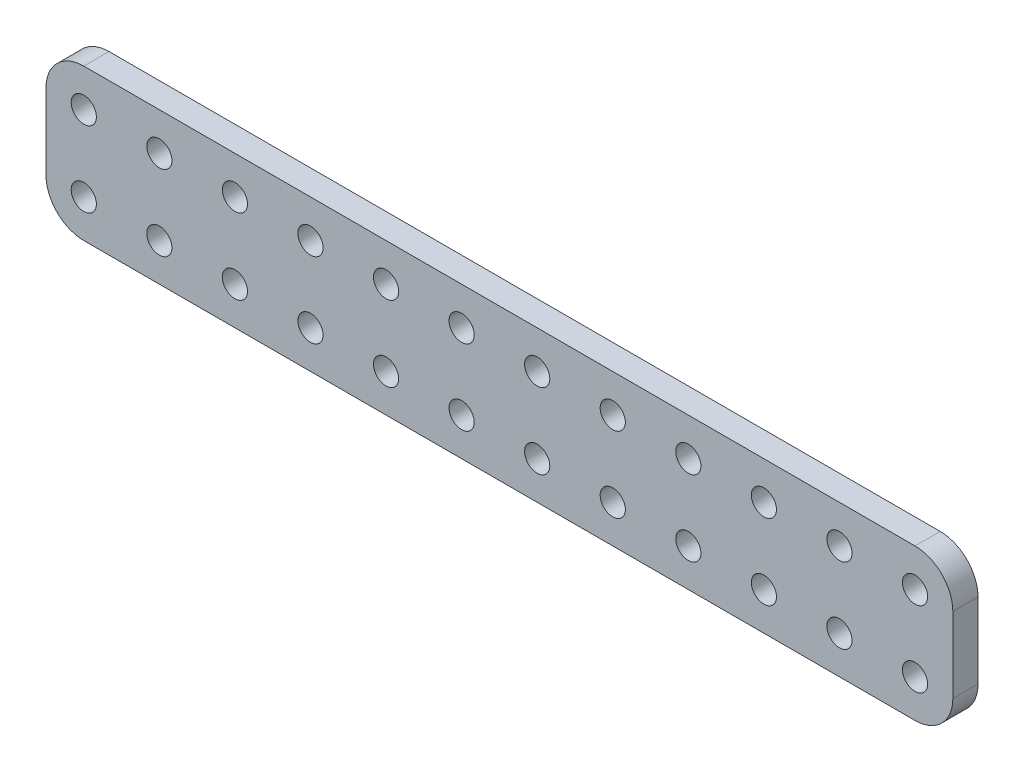
ISO-10303-21;
HEADER;
FILE_DESCRIPTION(('STEP AP214'),'2;1');
FILE_NAME('part.step','',(''),(''),'','','');
FILE_SCHEMA(('AUTOMOTIVE_DESIGN { 1 0 10303 214 1 1 1 1 }'));
ENDSEC;
DATA;
#1=APPLICATION_CONTEXT('core data for automotive mechanical design processes');
#2=APPLICATION_PROTOCOL_DEFINITION('international standard','automotive_design',2000,#1);
#3=PRODUCT_CONTEXT('',#1,'mechanical');
#4=PRODUCT('Part','Part','',(#3));
#5=PRODUCT_RELATED_PRODUCT_CATEGORY('part','',(#4));
#6=PRODUCT_DEFINITION_FORMATION('','',#4);
#7=PRODUCT_DEFINITION_CONTEXT('part definition',#1,'design');
#8=PRODUCT_DEFINITION('design','',#6,#7);
#9=PRODUCT_DEFINITION_SHAPE('','',#8);
#10=(LENGTH_UNIT() NAMED_UNIT(*) SI_UNIT(.MILLI.,.METRE.));
#11=(NAMED_UNIT(*) PLANE_ANGLE_UNIT() SI_UNIT($,.RADIAN.));
#12=(NAMED_UNIT(*) SI_UNIT($,.STERADIAN.) SOLID_ANGLE_UNIT());
#13=UNCERTAINTY_MEASURE_WITH_UNIT(LENGTH_MEASURE(1.E-05),#10,'distance_accuracy_value','');
#14=(GEOMETRIC_REPRESENTATION_CONTEXT(3) GLOBAL_UNCERTAINTY_ASSIGNED_CONTEXT((#13)) GLOBAL_UNIT_ASSIGNED_CONTEXT((#10,
#11,#12)) REPRESENTATION_CONTEXT('',''));
#15=CARTESIAN_POINT('',(0.,0.,0.));
#16=DIRECTION('',(0.,0.,1.));
#17=DIRECTION('',(1.,0.,0.));
#18=AXIS2_PLACEMENT_3D('',#15,#16,#17);
#19=CARTESIAN_POINT('',(355.4291313108,224.2422436139,3.));
#20=DIRECTION('',(0.,0.,1.));
#21=DIRECTION('',(1.,0.,0.));
#22=AXIS2_PLACEMENT_3D('',#19,#20,#21);
#23=PLANE('',#22);
#24=CARTESIAN_POINT('',(355.4291313108,215.2422436139,3.));
#25=DIRECTION('',(0.,0.,1.));
#26=DIRECTION('',(1.,0.,0.));
#27=AXIS2_PLACEMENT_3D('',#24,#25,#26);
#28=CIRCLE('',#27,1.5);
#29=CARTESIAN_POINT('',(356.9291313108,215.2422436139,3.));
#30=VERTEX_POINT('',#29);
#31=EDGE_CURVE('E308',#30,#30,#28,.T.);
#32=ORIENTED_EDGE('',*,*,#31,.F.);
#33=EDGE_LOOP('',(#32));
#34=FACE_BOUND('',#33,.T.);
#35=CARTESIAN_POINT('',(328.4291313108,224.2422436139,3.));
#36=DIRECTION('',(0.,0.,1.));
#37=DIRECTION('',(1.,0.,0.));
#38=AXIS2_PLACEMENT_3D('',#35,#36,#37);
#39=CIRCLE('',#38,1.5);
#40=CARTESIAN_POINT('',(329.9291313108,224.2422436139,3.));
#41=VERTEX_POINT('',#40);
#42=EDGE_CURVE('E296',#41,#41,#39,.T.);
#43=ORIENTED_EDGE('',*,*,#42,.F.);
#44=EDGE_LOOP('',(#43));
#45=FACE_BOUND('',#44,.T.);
#46=CARTESIAN_POINT('',(337.4291313108,224.2422436139,3.));
#47=DIRECTION('',(0.,0.,1.));
#48=DIRECTION('',(1.,0.,0.));
#49=AXIS2_PLACEMENT_3D('',#46,#47,#48);
#50=CIRCLE('',#49,1.5);
#51=CARTESIAN_POINT('',(338.9291313108,224.2422436139,3.));
#52=VERTEX_POINT('',#51);
#53=EDGE_CURVE('E284',#52,#52,#50,.T.);
#54=ORIENTED_EDGE('',*,*,#53,.F.);
#55=EDGE_LOOP('',(#54));
#56=FACE_BOUND('',#55,.T.);
#57=CARTESIAN_POINT('',(256.4291313108,224.2422436139,3.));
#58=DIRECTION('',(0.,0.,1.));
#59=DIRECTION('',(1.,0.,0.));
#60=AXIS2_PLACEMENT_3D('',#57,#58,#59);
#61=CIRCLE('',#60,1.50000000000006);
#62=CARTESIAN_POINT('',(257.9291313108,224.2422436139,3.));
#63=VERTEX_POINT('',#62);
#64=EDGE_CURVE('E272',#63,#63,#61,.T.);
#65=ORIENTED_EDGE('',*,*,#64,.F.);
#66=EDGE_LOOP('',(#65));
#67=FACE_BOUND('',#66,.T.);
#68=CARTESIAN_POINT('',(274.4291313108,224.2422436139,3.));
#69=DIRECTION('',(0.,0.,1.));
#70=DIRECTION('',(1.,0.,0.));
#71=AXIS2_PLACEMENT_3D('',#68,#69,#70);
#72=CIRCLE('',#71,1.5);
#73=CARTESIAN_POINT('',(275.9291313108,224.2422436139,3.));
#74=VERTEX_POINT('',#73);
#75=EDGE_CURVE('E260',#74,#74,#72,.T.);
#76=ORIENTED_EDGE('',*,*,#75,.F.);
#77=EDGE_LOOP('',(#76));
#78=FACE_BOUND('',#77,.T.);
#79=CARTESIAN_POINT('',(256.4291313108,215.2422436139,3.));
#80=DIRECTION('',(0.,0.,1.));
#81=DIRECTION('',(1.,0.,0.));
#82=AXIS2_PLACEMENT_3D('',#79,#80,#81);
#83=CIRCLE('',#82,1.49999999999983);
#84=CARTESIAN_POINT('',(257.9291313108,215.2422436139,3.));
#85=VERTEX_POINT('',#84);
#86=EDGE_CURVE('E248',#85,#85,#83,.T.);
#87=ORIENTED_EDGE('',*,*,#86,.F.);
#88=EDGE_LOOP('',(#87));
#89=FACE_BOUND('',#88,.T.);
#90=CARTESIAN_POINT('',(283.4291313108,215.2422436139,3.));
#91=DIRECTION('',(0.,0.,1.));
#92=DIRECTION('',(1.,0.,0.));
#93=AXIS2_PLACEMENT_3D('',#90,#91,#92);
#94=CIRCLE('',#93,1.5);
#95=CARTESIAN_POINT('',(284.9291313108,215.2422436139,3.));
#96=VERTEX_POINT('',#95);
#97=EDGE_CURVE('E236',#96,#96,#94,.T.);
#98=ORIENTED_EDGE('',*,*,#97,.F.);
#99=EDGE_LOOP('',(#98));
#100=FACE_BOUND('',#99,.T.);
#101=CARTESIAN_POINT('',(301.4291313108,215.2422436139,3.));
#102=DIRECTION('',(0.,0.,1.));
#103=DIRECTION('',(1.,0.,0.));
#104=AXIS2_PLACEMENT_3D('',#101,#102,#103);
#105=CIRCLE('',#104,1.5);
#106=CARTESIAN_POINT('',(302.9291313108,215.2422436139,3.));
#107=VERTEX_POINT('',#106);
#108=EDGE_CURVE('E224',#107,#107,#105,.T.);
#109=ORIENTED_EDGE('',*,*,#108,.F.);
#110=EDGE_LOOP('',(#109));
#111=FACE_BOUND('',#110,.T.);
#112=CARTESIAN_POINT('',(310.4291313108,215.2422436139,3.));
#113=DIRECTION('',(0.,0.,1.));
#114=DIRECTION('',(1.,0.,0.));
#115=AXIS2_PLACEMENT_3D('',#112,#113,#114);
#116=CIRCLE('',#115,1.5);
#117=CARTESIAN_POINT('',(311.9291313108,215.2422436139,3.));
#118=VERTEX_POINT('',#117);
#119=EDGE_CURVE('E212',#118,#118,#116,.T.);
#120=ORIENTED_EDGE('',*,*,#119,.F.);
#121=EDGE_LOOP('',(#120));
#122=FACE_BOUND('',#121,.T.);
#123=CARTESIAN_POINT('',(319.4291313108,215.2422436139,3.));
#124=DIRECTION('',(0.,0.,1.));
#125=DIRECTION('',(1.,0.,0.));
#126=AXIS2_PLACEMENT_3D('',#123,#124,#125);
#127=CIRCLE('',#126,1.5);
#128=CARTESIAN_POINT('',(320.9291313108,215.2422436139,3.));
#129=VERTEX_POINT('',#128);
#130=EDGE_CURVE('E200',#129,#129,#127,.T.);
#131=ORIENTED_EDGE('',*,*,#130,.F.);
#132=EDGE_LOOP('',(#131));
#133=FACE_BOUND('',#132,.T.);
#134=CARTESIAN_POINT('',(301.4291313108,224.2422436139,3.));
#135=DIRECTION('',(0.,0.,1.));
#136=DIRECTION('',(1.,0.,0.));
#137=AXIS2_PLACEMENT_3D('',#134,#135,#136);
#138=CIRCLE('',#137,1.5);
#139=CARTESIAN_POINT('',(302.9291313108,224.2422436139,3.));
#140=VERTEX_POINT('',#139);
#141=EDGE_CURVE('E188',#140,#140,#138,.T.);
#142=ORIENTED_EDGE('',*,*,#141,.F.);
#143=EDGE_LOOP('',(#142));
#144=FACE_BOUND('',#143,.T.);
#145=CARTESIAN_POINT('',(310.4291313108,224.2422436139,3.));
#146=DIRECTION('',(0.,0.,1.));
#147=DIRECTION('',(1.,0.,0.));
#148=AXIS2_PLACEMENT_3D('',#145,#146,#147);
#149=CIRCLE('',#148,1.5);
#150=CARTESIAN_POINT('',(311.9291313108,224.2422436139,3.));
#151=VERTEX_POINT('',#150);
#152=EDGE_CURVE('E134',#151,#151,#149,.T.);
#153=ORIENTED_EDGE('',*,*,#152,.F.);
#154=EDGE_LOOP('',(#153));
#155=FACE_BOUND('',#154,.T.);
#156=CARTESIAN_POINT('',(355.4291313108,224.2422436139,3.));
#157=DIRECTION('',(0.,0.,1.));
#158=DIRECTION('',(1.,0.,0.));
#159=AXIS2_PLACEMENT_3D('',#156,#157,#158);
#160=CIRCLE('',#159,4.5);
#161=CARTESIAN_POINT('',(359.9291313108,224.2422436139,3.));
#162=VERTEX_POINT('',#161);
#163=CARTESIAN_POINT('',(355.4291313108,228.7422436139,3.));
#164=VERTEX_POINT('',#163);
#165=EDGE_CURVE('E145',#162,#164,#160,.T.);
#166=ORIENTED_EDGE('',*,*,#165,.T.);
#167=DIRECTION('',(-1.,0.,0.));
#168=VECTOR('',#167,1.);
#169=CARTESIAN_POINT('',(256.4291313108,228.7422436139,3.));
#170=LINE('',#169,#168);
#171=CARTESIAN_POINT('',(256.4291313108,228.7422436139,3.));
#172=VERTEX_POINT('',#171);
#173=EDGE_CURVE('E93',#164,#172,#170,.T.);
#174=ORIENTED_EDGE('',*,*,#173,.T.);
#175=CARTESIAN_POINT('',(256.4291313108,224.2422436139,3.));
#176=DIRECTION('',(0.,0.,1.));
#177=DIRECTION('',(1.,0.,0.));
#178=AXIS2_PLACEMENT_3D('',#175,#176,#177);
#179=CIRCLE('',#178,4.5);
#180=CARTESIAN_POINT('',(251.9291313108,224.2422436139,3.));
#181=VERTEX_POINT('',#180);
#182=EDGE_CURVE('E160',#172,#181,#179,.T.);
#183=ORIENTED_EDGE('',*,*,#182,.T.);
#184=DIRECTION('',(0.,-1.,0.));
#185=VECTOR('',#184,1.);
#186=CARTESIAN_POINT('',(251.9291313108,224.2422436139,3.));
#187=LINE('',#186,#185);
#188=CARTESIAN_POINT('',(251.9291313108,215.2422436139,3.));
#189=VERTEX_POINT('',#188);
#190=EDGE_CURVE('E173',#181,#189,#187,.T.);
#191=ORIENTED_EDGE('',*,*,#190,.T.);
#192=CARTESIAN_POINT('',(256.4291313108,215.2422436139,3.));
#193=DIRECTION('',(0.,0.,1.));
#194=DIRECTION('',(1.,0.,0.));
#195=AXIS2_PLACEMENT_3D('',#192,#193,#194);
#196=CIRCLE('',#195,4.50000000000023);
#197=CARTESIAN_POINT('',(256.4291313108,210.7422436139,3.));
#198=VERTEX_POINT('',#197);
#199=EDGE_CURVE('E112',#189,#198,#196,.T.);
#200=ORIENTED_EDGE('',*,*,#199,.T.);
#201=DIRECTION('',(1.,0.,0.));
#202=VECTOR('',#201,1.);
#203=CARTESIAN_POINT('',(355.4291313108,210.7422436139,3.));
#204=LINE('',#203,#202);
#205=CARTESIAN_POINT('',(355.4291313108,210.7422436139,3.));
#206=VERTEX_POINT('',#205);
#207=EDGE_CURVE('E106',#198,#206,#204,.T.);
#208=ORIENTED_EDGE('',*,*,#207,.T.);
#209=CARTESIAN_POINT('',(355.4291313108,215.2422436139,3.));
#210=DIRECTION('',(0.,0.,1.));
#211=DIRECTION('',(1.,0.,0.));
#212=AXIS2_PLACEMENT_3D('',#209,#210,#211);
#213=CIRCLE('',#212,4.5);
#214=CARTESIAN_POINT('',(359.9291313108,215.2422436139,3.));
#215=VERTEX_POINT('',#214);
#216=EDGE_CURVE('E110',#206,#215,#213,.T.);
#217=ORIENTED_EDGE('',*,*,#216,.T.);
#218=DIRECTION('',(0.,1.,0.));
#219=VECTOR('',#218,1.);
#220=CARTESIAN_POINT('',(359.9291313108,224.2422436139,3.));
#221=LINE('',#220,#219);
#222=EDGE_CURVE('E50',#215,#162,#221,.T.);
#223=ORIENTED_EDGE('',*,*,#222,.T.);
#224=EDGE_LOOP('',(#166,#174,#183,#191,#200,#208,#217,#223));
#225=FACE_BOUND('',#224,.T.);
#226=CARTESIAN_POINT('',(292.4291313108,224.2422436139,3.));
#227=DIRECTION('',(0.,0.,1.));
#228=DIRECTION('',(1.,0.,0.));
#229=AXIS2_PLACEMENT_3D('',#226,#227,#228);
#230=CIRCLE('',#229,1.5);
#231=CARTESIAN_POINT('',(293.9291313108,224.2422436139,3.));
#232=VERTEX_POINT('',#231);
#233=EDGE_CURVE('E182',#232,#232,#230,.T.);
#234=ORIENTED_EDGE('',*,*,#233,.F.);
#235=EDGE_LOOP('',(#234));
#236=FACE_BOUND('',#235,.T.);
#237=CARTESIAN_POINT('',(337.4291313108,215.2422436139,3.));
#238=DIRECTION('',(0.,0.,1.));
#239=DIRECTION('',(1.,0.,0.));
#240=AXIS2_PLACEMENT_3D('',#237,#238,#239);
#241=CIRCLE('',#240,1.5);
#242=CARTESIAN_POINT('',(338.9291313108,215.2422436139,3.));
#243=VERTEX_POINT('',#242);
#244=EDGE_CURVE('E194',#243,#243,#241,.T.);
#245=ORIENTED_EDGE('',*,*,#244,.F.);
#246=EDGE_LOOP('',(#245));
#247=FACE_BOUND('',#246,.T.);
#248=CARTESIAN_POINT('',(328.4291313108,215.2422436139,3.));
#249=DIRECTION('',(0.,0.,1.));
#250=DIRECTION('',(1.,0.,0.));
#251=AXIS2_PLACEMENT_3D('',#248,#249,#250);
#252=CIRCLE('',#251,1.5);
#253=CARTESIAN_POINT('',(329.9291313108,215.2422436139,3.));
#254=VERTEX_POINT('',#253);
#255=EDGE_CURVE('E206',#254,#254,#252,.T.);
#256=ORIENTED_EDGE('',*,*,#255,.F.);
#257=EDGE_LOOP('',(#256));
#258=FACE_BOUND('',#257,.T.);
#259=CARTESIAN_POINT('',(292.4291313108,215.2422436139,3.));
#260=DIRECTION('',(0.,0.,1.));
#261=DIRECTION('',(1.,0.,0.));
#262=AXIS2_PLACEMENT_3D('',#259,#260,#261);
#263=CIRCLE('',#262,1.5);
#264=CARTESIAN_POINT('',(293.9291313108,215.2422436139,3.));
#265=VERTEX_POINT('',#264);
#266=EDGE_CURVE('E218',#265,#265,#263,.T.);
#267=ORIENTED_EDGE('',*,*,#266,.F.);
#268=EDGE_LOOP('',(#267));
#269=FACE_BOUND('',#268,.T.);
#270=CARTESIAN_POINT('',(274.4291313108,215.2422436139,3.));
#271=DIRECTION('',(0.,0.,1.));
#272=DIRECTION('',(1.,0.,0.));
#273=AXIS2_PLACEMENT_3D('',#270,#271,#272);
#274=CIRCLE('',#273,1.5);
#275=CARTESIAN_POINT('',(275.9291313108,215.2422436139,3.));
#276=VERTEX_POINT('',#275);
#277=EDGE_CURVE('E230',#276,#276,#274,.T.);
#278=ORIENTED_EDGE('',*,*,#277,.F.);
#279=EDGE_LOOP('',(#278));
#280=FACE_BOUND('',#279,.T.);
#281=CARTESIAN_POINT('',(265.4291313108,215.2422436139,3.));
#282=DIRECTION('',(0.,0.,1.));
#283=DIRECTION('',(1.,0.,0.));
#284=AXIS2_PLACEMENT_3D('',#281,#282,#283);
#285=CIRCLE('',#284,1.5);
#286=CARTESIAN_POINT('',(266.9291313108,215.2422436139,3.));
#287=VERTEX_POINT('',#286);
#288=EDGE_CURVE('E242',#287,#287,#285,.T.);
#289=ORIENTED_EDGE('',*,*,#288,.F.);
#290=EDGE_LOOP('',(#289));
#291=FACE_BOUND('',#290,.T.);
#292=CARTESIAN_POINT('',(346.4291313108,215.2422436139,3.));
#293=DIRECTION('',(0.,0.,1.));
#294=DIRECTION('',(1.,0.,0.));
#295=AXIS2_PLACEMENT_3D('',#292,#293,#294);
#296=CIRCLE('',#295,1.5);
#297=CARTESIAN_POINT('',(347.9291313108,215.2422436139,3.));
#298=VERTEX_POINT('',#297);
#299=EDGE_CURVE('E254',#298,#298,#296,.T.);
#300=ORIENTED_EDGE('',*,*,#299,.F.);
#301=EDGE_LOOP('',(#300));
#302=FACE_BOUND('',#301,.T.);
#303=CARTESIAN_POINT('',(265.4291313108,224.2422436139,3.));
#304=DIRECTION('',(0.,0.,1.));
#305=DIRECTION('',(1.,0.,0.));
#306=AXIS2_PLACEMENT_3D('',#303,#304,#305);
#307=CIRCLE('',#306,1.5);
#308=CARTESIAN_POINT('',(266.9291313108,224.2422436139,3.));
#309=VERTEX_POINT('',#308);
#310=EDGE_CURVE('E266',#309,#309,#307,.T.);
#311=ORIENTED_EDGE('',*,*,#310,.F.);
#312=EDGE_LOOP('',(#311));
#313=FACE_BOUND('',#312,.T.);
#314=CARTESIAN_POINT('',(283.4291313108,224.2422436139,3.));
#315=DIRECTION('',(0.,0.,1.));
#316=DIRECTION('',(1.,0.,0.));
#317=AXIS2_PLACEMENT_3D('',#314,#315,#316);
#318=CIRCLE('',#317,1.5);
#319=CARTESIAN_POINT('',(284.9291313108,224.2422436139,3.));
#320=VERTEX_POINT('',#319);
#321=EDGE_CURVE('E278',#320,#320,#318,.T.);
#322=ORIENTED_EDGE('',*,*,#321,.F.);
#323=EDGE_LOOP('',(#322));
#324=FACE_BOUND('',#323,.T.);
#325=CARTESIAN_POINT('',(319.4291313108,224.2422436139,3.));
#326=DIRECTION('',(0.,0.,1.));
#327=DIRECTION('',(1.,0.,0.));
#328=AXIS2_PLACEMENT_3D('',#325,#326,#327);
#329=CIRCLE('',#328,1.5);
#330=CARTESIAN_POINT('',(320.9291313108,224.2422436139,3.));
#331=VERTEX_POINT('',#330);
#332=EDGE_CURVE('E290',#331,#331,#329,.T.);
#333=ORIENTED_EDGE('',*,*,#332,.F.);
#334=EDGE_LOOP('',(#333));
#335=FACE_BOUND('',#334,.T.);
#336=CARTESIAN_POINT('',(346.4291313108,224.2422436139,3.));
#337=DIRECTION('',(0.,0.,1.));
#338=DIRECTION('',(1.,0.,0.));
#339=AXIS2_PLACEMENT_3D('',#336,#337,#338);
#340=CIRCLE('',#339,1.5);
#341=CARTESIAN_POINT('',(347.9291313108,224.2422436139,3.));
#342=VERTEX_POINT('',#341);
#343=EDGE_CURVE('E302',#342,#342,#340,.T.);
#344=ORIENTED_EDGE('',*,*,#343,.F.);
#345=EDGE_LOOP('',(#344));
#346=FACE_BOUND('',#345,.T.);
#347=CARTESIAN_POINT('',(355.4291313108,224.2422436139,3.));
#348=DIRECTION('',(0.,0.,1.));
#349=DIRECTION('',(1.,0.,0.));
#350=AXIS2_PLACEMENT_3D('',#347,#348,#349);
#351=CIRCLE('',#350,1.5);
#352=CARTESIAN_POINT('',(356.9291313108,224.2422436139,3.));
#353=VERTEX_POINT('',#352);
#354=EDGE_CURVE('E314',#353,#353,#351,.T.);
#355=ORIENTED_EDGE('',*,*,#354,.F.);
#356=EDGE_LOOP('',(#355));
#357=FACE_BOUND('',#356,.T.);
#358=ADVANCED_FACE('F33',(#34,#45,#56,#67,#78,#89,#100,#111,#122,#133,#144,#155,#225,#236,#247,
#258,#269,#280,#291,#302,#313,#324,#335,#346,#357),#23,.T.);
#359=CARTESIAN_POINT('',(355.4291313108,224.2422436139,0.));
#360=DIRECTION('',(0.,0.,1.));
#361=DIRECTION('',(1.,0.,0.));
#362=AXIS2_PLACEMENT_3D('',#359,#360,#361);
#363=PLANE('',#362);
#364=CARTESIAN_POINT('',(355.4291313108,215.2422436139,0.));
#365=DIRECTION('',(0.,0.,1.));
#366=DIRECTION('',(1.,0.,0.));
#367=AXIS2_PLACEMENT_3D('',#364,#365,#366);
#368=CIRCLE('',#367,1.5);
#369=CARTESIAN_POINT('',(356.9291313108,215.2422436139,0.));
#370=VERTEX_POINT('',#369);
#371=EDGE_CURVE('E311',#370,#370,#368,.T.);
#372=ORIENTED_EDGE('',*,*,#371,.T.);
#373=EDGE_LOOP('',(#372));
#374=FACE_BOUND('',#373,.T.);
#375=CARTESIAN_POINT('',(328.4291313108,224.2422436139,0.));
#376=DIRECTION('',(0.,0.,1.));
#377=DIRECTION('',(1.,0.,0.));
#378=AXIS2_PLACEMENT_3D('',#375,#376,#377);
#379=CIRCLE('',#378,1.5);
#380=CARTESIAN_POINT('',(329.9291313108,224.2422436139,0.));
#381=VERTEX_POINT('',#380);
#382=EDGE_CURVE('E299',#381,#381,#379,.T.);
#383=ORIENTED_EDGE('',*,*,#382,.T.);
#384=EDGE_LOOP('',(#383));
#385=FACE_BOUND('',#384,.T.);
#386=CARTESIAN_POINT('',(337.4291313108,224.2422436139,0.));
#387=DIRECTION('',(0.,0.,1.));
#388=DIRECTION('',(1.,0.,0.));
#389=AXIS2_PLACEMENT_3D('',#386,#387,#388);
#390=CIRCLE('',#389,1.5);
#391=CARTESIAN_POINT('',(338.9291313108,224.2422436139,0.));
#392=VERTEX_POINT('',#391);
#393=EDGE_CURVE('E287',#392,#392,#390,.T.);
#394=ORIENTED_EDGE('',*,*,#393,.T.);
#395=EDGE_LOOP('',(#394));
#396=FACE_BOUND('',#395,.T.);
#397=CARTESIAN_POINT('',(256.4291313108,224.2422436139,0.));
#398=DIRECTION('',(0.,0.,1.));
#399=DIRECTION('',(1.,0.,0.));
#400=AXIS2_PLACEMENT_3D('',#397,#398,#399);
#401=CIRCLE('',#400,1.50000000000006);
#402=CARTESIAN_POINT('',(257.9291313108,224.2422436139,0.));
#403=VERTEX_POINT('',#402);
#404=EDGE_CURVE('E275',#403,#403,#401,.T.);
#405=ORIENTED_EDGE('',*,*,#404,.T.);
#406=EDGE_LOOP('',(#405));
#407=FACE_BOUND('',#406,.T.);
#408=CARTESIAN_POINT('',(274.4291313108,224.2422436139,0.));
#409=DIRECTION('',(0.,0.,1.));
#410=DIRECTION('',(1.,0.,0.));
#411=AXIS2_PLACEMENT_3D('',#408,#409,#410);
#412=CIRCLE('',#411,1.5);
#413=CARTESIAN_POINT('',(275.9291313108,224.2422436139,0.));
#414=VERTEX_POINT('',#413);
#415=EDGE_CURVE('E263',#414,#414,#412,.T.);
#416=ORIENTED_EDGE('',*,*,#415,.T.);
#417=EDGE_LOOP('',(#416));
#418=FACE_BOUND('',#417,.T.);
#419=CARTESIAN_POINT('',(256.4291313108,215.2422436139,0.));
#420=DIRECTION('',(0.,0.,1.));
#421=DIRECTION('',(1.,0.,0.));
#422=AXIS2_PLACEMENT_3D('',#419,#420,#421);
#423=CIRCLE('',#422,1.49999999999983);
#424=CARTESIAN_POINT('',(257.9291313108,215.2422436139,0.));
#425=VERTEX_POINT('',#424);
#426=EDGE_CURVE('E251',#425,#425,#423,.T.);
#427=ORIENTED_EDGE('',*,*,#426,.T.);
#428=EDGE_LOOP('',(#427));
#429=FACE_BOUND('',#428,.T.);
#430=CARTESIAN_POINT('',(283.4291313108,215.2422436139,0.));
#431=DIRECTION('',(0.,0.,1.));
#432=DIRECTION('',(1.,0.,0.));
#433=AXIS2_PLACEMENT_3D('',#430,#431,#432);
#434=CIRCLE('',#433,1.5);
#435=CARTESIAN_POINT('',(284.9291313108,215.2422436139,0.));
#436=VERTEX_POINT('',#435);
#437=EDGE_CURVE('E239',#436,#436,#434,.T.);
#438=ORIENTED_EDGE('',*,*,#437,.T.);
#439=EDGE_LOOP('',(#438));
#440=FACE_BOUND('',#439,.T.);
#441=CARTESIAN_POINT('',(301.4291313108,215.2422436139,0.));
#442=DIRECTION('',(0.,0.,1.));
#443=DIRECTION('',(1.,0.,0.));
#444=AXIS2_PLACEMENT_3D('',#441,#442,#443);
#445=CIRCLE('',#444,1.5);
#446=CARTESIAN_POINT('',(302.9291313108,215.2422436139,0.));
#447=VERTEX_POINT('',#446);
#448=EDGE_CURVE('E227',#447,#447,#445,.T.);
#449=ORIENTED_EDGE('',*,*,#448,.T.);
#450=EDGE_LOOP('',(#449));
#451=FACE_BOUND('',#450,.T.);
#452=CARTESIAN_POINT('',(310.4291313108,215.2422436139,0.));
#453=DIRECTION('',(0.,0.,1.));
#454=DIRECTION('',(1.,0.,0.));
#455=AXIS2_PLACEMENT_3D('',#452,#453,#454);
#456=CIRCLE('',#455,1.5);
#457=CARTESIAN_POINT('',(311.9291313108,215.2422436139,0.));
#458=VERTEX_POINT('',#457);
#459=EDGE_CURVE('E215',#458,#458,#456,.T.);
#460=ORIENTED_EDGE('',*,*,#459,.T.);
#461=EDGE_LOOP('',(#460));
#462=FACE_BOUND('',#461,.T.);
#463=CARTESIAN_POINT('',(319.4291313108,215.2422436139,0.));
#464=DIRECTION('',(0.,0.,1.));
#465=DIRECTION('',(1.,0.,0.));
#466=AXIS2_PLACEMENT_3D('',#463,#464,#465);
#467=CIRCLE('',#466,1.5);
#468=CARTESIAN_POINT('',(320.9291313108,215.2422436139,0.));
#469=VERTEX_POINT('',#468);
#470=EDGE_CURVE('E203',#469,#469,#467,.T.);
#471=ORIENTED_EDGE('',*,*,#470,.T.);
#472=EDGE_LOOP('',(#471));
#473=FACE_BOUND('',#472,.T.);
#474=CARTESIAN_POINT('',(301.4291313108,224.2422436139,0.));
#475=DIRECTION('',(0.,0.,1.));
#476=DIRECTION('',(1.,0.,0.));
#477=AXIS2_PLACEMENT_3D('',#474,#475,#476);
#478=CIRCLE('',#477,1.5);
#479=CARTESIAN_POINT('',(302.9291313108,224.2422436139,0.));
#480=VERTEX_POINT('',#479);
#481=EDGE_CURVE('E191',#480,#480,#478,.T.);
#482=ORIENTED_EDGE('',*,*,#481,.T.);
#483=EDGE_LOOP('',(#482));
#484=FACE_BOUND('',#483,.T.);
#485=CARTESIAN_POINT('',(310.4291313108,224.2422436139,0.));
#486=DIRECTION('',(0.,0.,1.));
#487=DIRECTION('',(1.,0.,0.));
#488=AXIS2_PLACEMENT_3D('',#485,#486,#487);
#489=CIRCLE('',#488,1.5);
#490=CARTESIAN_POINT('',(311.9291313108,224.2422436139,0.));
#491=VERTEX_POINT('',#490);
#492=EDGE_CURVE('E179',#491,#491,#489,.T.);
#493=ORIENTED_EDGE('',*,*,#492,.T.);
#494=EDGE_LOOP('',(#493));
#495=FACE_BOUND('',#494,.T.);
#496=CARTESIAN_POINT('',(355.4291313108,224.2422436139,0.));
#497=DIRECTION('',(0.,0.,1.));
#498=DIRECTION('',(1.,0.,0.));
#499=AXIS2_PLACEMENT_3D('',#496,#497,#498);
#500=CIRCLE('',#499,4.5);
#501=CARTESIAN_POINT('',(359.9291313108,224.2422436139,0.));
#502=VERTEX_POINT('',#501);
#503=CARTESIAN_POINT('',(355.4291313108,228.7422436139,0.));
#504=VERTEX_POINT('',#503);
#505=EDGE_CURVE('E130',#502,#504,#500,.T.);
#506=ORIENTED_EDGE('',*,*,#505,.F.);
#507=DIRECTION('',(0.,1.,0.));
#508=VECTOR('',#507,1.);
#509=CARTESIAN_POINT('',(359.9291313108,224.2422436139,0.));
#510=LINE('',#509,#508);
#511=CARTESIAN_POINT('',(359.9291313108,215.2422436139,0.));
#512=VERTEX_POINT('',#511);
#513=EDGE_CURVE('E85',#512,#502,#510,.T.);
#514=ORIENTED_EDGE('',*,*,#513,.F.);
#515=CARTESIAN_POINT('',(355.4291313108,215.2422436139,0.));
#516=DIRECTION('',(0.,0.,1.));
#517=DIRECTION('',(1.,0.,0.));
#518=AXIS2_PLACEMENT_3D('',#515,#516,#517);
#519=CIRCLE('',#518,4.5);
#520=CARTESIAN_POINT('',(355.4291313108,210.7422436139,0.));
#521=VERTEX_POINT('',#520);
#522=EDGE_CURVE('E79',#521,#512,#519,.T.);
#523=ORIENTED_EDGE('',*,*,#522,.F.);
#524=DIRECTION('',(1.,0.,0.));
#525=VECTOR('',#524,1.);
#526=CARTESIAN_POINT('',(355.4291313108,210.7422436139,0.));
#527=LINE('',#526,#525);
#528=CARTESIAN_POINT('',(256.4291313108,210.7422436139,0.));
#529=VERTEX_POINT('',#528);
#530=EDGE_CURVE('E120',#529,#521,#527,.T.);
#531=ORIENTED_EDGE('',*,*,#530,.F.);
#532=CARTESIAN_POINT('',(256.4291313108,215.2422436139,0.));
#533=DIRECTION('',(0.,0.,1.));
#534=DIRECTION('',(1.,0.,0.));
#535=AXIS2_PLACEMENT_3D('',#532,#533,#534);
#536=CIRCLE('',#535,4.50000000000023);
#537=CARTESIAN_POINT('',(251.9291313108,215.2422436139,0.));
#538=VERTEX_POINT('',#537);
#539=EDGE_CURVE('E140',#538,#529,#536,.T.);
#540=ORIENTED_EDGE('',*,*,#539,.F.);
#541=DIRECTION('',(0.,-1.,0.));
#542=VECTOR('',#541,1.);
#543=CARTESIAN_POINT('',(251.9291313108,224.2422436139,0.));
#544=LINE('',#543,#542);
#545=CARTESIAN_POINT('',(251.9291313108,224.2422436139,0.));
#546=VERTEX_POINT('',#545);
#547=EDGE_CURVE('E138',#546,#538,#544,.T.);
#548=ORIENTED_EDGE('',*,*,#547,.F.);
#549=CARTESIAN_POINT('',(256.4291313108,224.2422436139,0.));
#550=DIRECTION('',(0.,0.,1.));
#551=DIRECTION('',(1.,0.,0.));
#552=AXIS2_PLACEMENT_3D('',#549,#550,#551);
#553=CIRCLE('',#552,4.5);
#554=CARTESIAN_POINT('',(256.4291313108,228.7422436139,0.));
#555=VERTEX_POINT('',#554);
#556=EDGE_CURVE('E136',#555,#546,#553,.T.);
#557=ORIENTED_EDGE('',*,*,#556,.F.);
#558=DIRECTION('',(-1.,0.,0.));
#559=VECTOR('',#558,1.);
#560=CARTESIAN_POINT('',(256.4291313108,228.7422436139,0.));
#561=LINE('',#560,#559);
#562=EDGE_CURVE('E133',#504,#555,#561,.T.);
#563=ORIENTED_EDGE('',*,*,#562,.F.);
#564=EDGE_LOOP('',(#506,#514,#523,#531,#540,#548,#557,#563));
#565=FACE_BOUND('',#564,.T.);
#566=CARTESIAN_POINT('',(292.4291313108,224.2422436139,0.));
#567=DIRECTION('',(0.,0.,1.));
#568=DIRECTION('',(1.,0.,0.));
#569=AXIS2_PLACEMENT_3D('',#566,#567,#568);
#570=CIRCLE('',#569,1.5);
#571=CARTESIAN_POINT('',(293.9291313108,224.2422436139,0.));
#572=VERTEX_POINT('',#571);
#573=EDGE_CURVE('E185',#572,#572,#570,.T.);
#574=ORIENTED_EDGE('',*,*,#573,.T.);
#575=EDGE_LOOP('',(#574));
#576=FACE_BOUND('',#575,.T.);
#577=CARTESIAN_POINT('',(337.4291313108,215.2422436139,0.));
#578=DIRECTION('',(0.,0.,1.));
#579=DIRECTION('',(1.,0.,0.));
#580=AXIS2_PLACEMENT_3D('',#577,#578,#579);
#581=CIRCLE('',#580,1.5);
#582=CARTESIAN_POINT('',(338.9291313108,215.2422436139,0.));
#583=VERTEX_POINT('',#582);
#584=EDGE_CURVE('E197',#583,#583,#581,.T.);
#585=ORIENTED_EDGE('',*,*,#584,.T.);
#586=EDGE_LOOP('',(#585));
#587=FACE_BOUND('',#586,.T.);
#588=CARTESIAN_POINT('',(328.4291313108,215.2422436139,0.));
#589=DIRECTION('',(0.,0.,1.));
#590=DIRECTION('',(1.,0.,0.));
#591=AXIS2_PLACEMENT_3D('',#588,#589,#590);
#592=CIRCLE('',#591,1.5);
#593=CARTESIAN_POINT('',(329.9291313108,215.2422436139,0.));
#594=VERTEX_POINT('',#593);
#595=EDGE_CURVE('E209',#594,#594,#592,.T.);
#596=ORIENTED_EDGE('',*,*,#595,.T.);
#597=EDGE_LOOP('',(#596));
#598=FACE_BOUND('',#597,.T.);
#599=CARTESIAN_POINT('',(292.4291313108,215.2422436139,0.));
#600=DIRECTION('',(0.,0.,1.));
#601=DIRECTION('',(1.,0.,0.));
#602=AXIS2_PLACEMENT_3D('',#599,#600,#601);
#603=CIRCLE('',#602,1.5);
#604=CARTESIAN_POINT('',(293.9291313108,215.2422436139,0.));
#605=VERTEX_POINT('',#604);
#606=EDGE_CURVE('E221',#605,#605,#603,.T.);
#607=ORIENTED_EDGE('',*,*,#606,.T.);
#608=EDGE_LOOP('',(#607));
#609=FACE_BOUND('',#608,.T.);
#610=CARTESIAN_POINT('',(274.4291313108,215.2422436139,0.));
#611=DIRECTION('',(0.,0.,1.));
#612=DIRECTION('',(1.,0.,0.));
#613=AXIS2_PLACEMENT_3D('',#610,#611,#612);
#614=CIRCLE('',#613,1.5);
#615=CARTESIAN_POINT('',(275.9291313108,215.2422436139,0.));
#616=VERTEX_POINT('',#615);
#617=EDGE_CURVE('E233',#616,#616,#614,.T.);
#618=ORIENTED_EDGE('',*,*,#617,.T.);
#619=EDGE_LOOP('',(#618));
#620=FACE_BOUND('',#619,.T.);
#621=CARTESIAN_POINT('',(265.4291313108,215.2422436139,0.));
#622=DIRECTION('',(0.,0.,1.));
#623=DIRECTION('',(1.,0.,0.));
#624=AXIS2_PLACEMENT_3D('',#621,#622,#623);
#625=CIRCLE('',#624,1.5);
#626=CARTESIAN_POINT('',(266.9291313108,215.2422436139,0.));
#627=VERTEX_POINT('',#626);
#628=EDGE_CURVE('E245',#627,#627,#625,.T.);
#629=ORIENTED_EDGE('',*,*,#628,.T.);
#630=EDGE_LOOP('',(#629));
#631=FACE_BOUND('',#630,.T.);
#632=CARTESIAN_POINT('',(346.4291313108,215.2422436139,0.));
#633=DIRECTION('',(0.,0.,1.));
#634=DIRECTION('',(1.,0.,0.));
#635=AXIS2_PLACEMENT_3D('',#632,#633,#634);
#636=CIRCLE('',#635,1.5);
#637=CARTESIAN_POINT('',(347.9291313108,215.2422436139,0.));
#638=VERTEX_POINT('',#637);
#639=EDGE_CURVE('E257',#638,#638,#636,.T.);
#640=ORIENTED_EDGE('',*,*,#639,.T.);
#641=EDGE_LOOP('',(#640));
#642=FACE_BOUND('',#641,.T.);
#643=CARTESIAN_POINT('',(265.4291313108,224.2422436139,0.));
#644=DIRECTION('',(0.,0.,1.));
#645=DIRECTION('',(1.,0.,0.));
#646=AXIS2_PLACEMENT_3D('',#643,#644,#645);
#647=CIRCLE('',#646,1.5);
#648=CARTESIAN_POINT('',(266.9291313108,224.2422436139,0.));
#649=VERTEX_POINT('',#648);
#650=EDGE_CURVE('E269',#649,#649,#647,.T.);
#651=ORIENTED_EDGE('',*,*,#650,.T.);
#652=EDGE_LOOP('',(#651));
#653=FACE_BOUND('',#652,.T.);
#654=CARTESIAN_POINT('',(283.4291313108,224.2422436139,0.));
#655=DIRECTION('',(0.,0.,1.));
#656=DIRECTION('',(1.,0.,0.));
#657=AXIS2_PLACEMENT_3D('',#654,#655,#656);
#658=CIRCLE('',#657,1.5);
#659=CARTESIAN_POINT('',(284.9291313108,224.2422436139,0.));
#660=VERTEX_POINT('',#659);
#661=EDGE_CURVE('E281',#660,#660,#658,.T.);
#662=ORIENTED_EDGE('',*,*,#661,.T.);
#663=EDGE_LOOP('',(#662));
#664=FACE_BOUND('',#663,.T.);
#665=CARTESIAN_POINT('',(319.4291313108,224.2422436139,0.));
#666=DIRECTION('',(0.,0.,1.));
#667=DIRECTION('',(1.,0.,0.));
#668=AXIS2_PLACEMENT_3D('',#665,#666,#667);
#669=CIRCLE('',#668,1.5);
#670=CARTESIAN_POINT('',(320.9291313108,224.2422436139,0.));
#671=VERTEX_POINT('',#670);
#672=EDGE_CURVE('E293',#671,#671,#669,.T.);
#673=ORIENTED_EDGE('',*,*,#672,.T.);
#674=EDGE_LOOP('',(#673));
#675=FACE_BOUND('',#674,.T.);
#676=CARTESIAN_POINT('',(346.4291313108,224.2422436139,0.));
#677=DIRECTION('',(0.,0.,1.));
#678=DIRECTION('',(1.,0.,0.));
#679=AXIS2_PLACEMENT_3D('',#676,#677,#678);
#680=CIRCLE('',#679,1.5);
#681=CARTESIAN_POINT('',(347.9291313108,224.2422436139,0.));
#682=VERTEX_POINT('',#681);
#683=EDGE_CURVE('E305',#682,#682,#680,.T.);
#684=ORIENTED_EDGE('',*,*,#683,.T.);
#685=EDGE_LOOP('',(#684));
#686=FACE_BOUND('',#685,.T.);
#687=CARTESIAN_POINT('',(355.4291313108,224.2422436139,0.));
#688=DIRECTION('',(0.,0.,1.));
#689=DIRECTION('',(1.,0.,0.));
#690=AXIS2_PLACEMENT_3D('',#687,#688,#689);
#691=CIRCLE('',#690,1.5);
#692=CARTESIAN_POINT('',(356.9291313108,224.2422436139,0.));
#693=VERTEX_POINT('',#692);
#694=EDGE_CURVE('E317',#693,#693,#691,.T.);
#695=ORIENTED_EDGE('',*,*,#694,.T.);
#696=EDGE_LOOP('',(#695));
#697=FACE_BOUND('',#696,.T.);
#698=ADVANCED_FACE('F164',(#374,#385,#396,#407,#418,#429,#440,#451,#462,#473,#484,#495,#565,
#576,#587,#598,#609,#620,#631,#642,#653,#664,#675,#686,#697),#363,.F.);
#699=CARTESIAN_POINT('',(355.4291313108,224.2422436139,3.));
#700=DIRECTION('',(0.,0.,-1.));
#701=DIRECTION('',(-1.,0.,0.));
#702=AXIS2_PLACEMENT_3D('',#699,#700,#701);
#703=CYLINDRICAL_SURFACE('',#702,4.5);
#704=ORIENTED_EDGE('',*,*,#505,.T.);
#705=DIRECTION('',(0.,0.,-1.));
#706=VECTOR('',#705,1.);
#707=CARTESIAN_POINT('',(355.4291313108,228.7422436139,3.));
#708=LINE('',#707,#706);
#709=EDGE_CURVE('E11',#164,#504,#708,.T.);
#710=ORIENTED_EDGE('',*,*,#709,.F.);
#711=ORIENTED_EDGE('',*,*,#165,.F.);
#712=DIRECTION('',(0.,0.,-1.));
#713=VECTOR('',#712,1.);
#714=CARTESIAN_POINT('',(359.9291313108,224.2422436139,3.));
#715=LINE('',#714,#713);
#716=EDGE_CURVE('E126',#162,#502,#715,.T.);
#717=ORIENTED_EDGE('',*,*,#716,.T.);
#718=EDGE_LOOP('',(#704,#710,#711,#717));
#719=FACE_BOUND('',#718,.T.);
#720=ADVANCED_FACE('F35',(#719),#703,.T.);
#721=CARTESIAN_POINT('',(256.4291313108,228.7422436139,3.));
#722=DIRECTION('',(0.,-1.,0.));
#723=DIRECTION('',(0.,0.,-1.));
#724=AXIS2_PLACEMENT_3D('',#721,#722,#723);
#725=PLANE('',#724);
#726=ORIENTED_EDGE('',*,*,#562,.T.);
#727=DIRECTION('',(0.,0.,-1.));
#728=VECTOR('',#727,1.);
#729=CARTESIAN_POINT('',(256.4291313108,228.7422436139,3.));
#730=LINE('',#729,#728);
#731=EDGE_CURVE('E42',#172,#555,#730,.T.);
#732=ORIENTED_EDGE('',*,*,#731,.F.);
#733=ORIENTED_EDGE('',*,*,#173,.F.);
#734=ORIENTED_EDGE('',*,*,#709,.T.);
#735=EDGE_LOOP('',(#726,#732,#733,#734));
#736=FACE_BOUND('',#735,.T.);
#737=ADVANCED_FACE('F352',(#736),#725,.F.);
#738=CARTESIAN_POINT('',(256.4291313108,224.2422436139,3.));
#739=DIRECTION('',(0.,0.,-1.));
#740=DIRECTION('',(-1.,0.,0.));
#741=AXIS2_PLACEMENT_3D('',#738,#739,#740);
#742=CYLINDRICAL_SURFACE('',#741,4.5);
#743=ORIENTED_EDGE('',*,*,#556,.T.);
#744=DIRECTION('',(0.,0.,-1.));
#745=VECTOR('',#744,1.);
#746=CARTESIAN_POINT('',(251.9291313108,224.2422436139,3.));
#747=LINE('',#746,#745);
#748=EDGE_CURVE('E152',#181,#546,#747,.T.);
#749=ORIENTED_EDGE('',*,*,#748,.F.);
#750=ORIENTED_EDGE('',*,*,#182,.F.);
#751=ORIENTED_EDGE('',*,*,#731,.T.);
#752=EDGE_LOOP('',(#743,#749,#750,#751));
#753=FACE_BOUND('',#752,.T.);
#754=ADVANCED_FACE('F158',(#753),#742,.T.);
#755=CARTESIAN_POINT('',(251.9291313108,224.2422436139,3.));
#756=DIRECTION('',(1.,0.,0.));
#757=DIRECTION('',(0.,0.,-1.));
#758=AXIS2_PLACEMENT_3D('',#755,#756,#757);
#759=PLANE('',#758);
#760=ORIENTED_EDGE('',*,*,#547,.T.);
#761=DIRECTION('',(0.,0.,-1.));
#762=VECTOR('',#761,1.);
#763=CARTESIAN_POINT('',(251.9291313108,215.2422436139,3.));
#764=LINE('',#763,#762);
#765=EDGE_CURVE('E149',#189,#538,#764,.T.);
#766=ORIENTED_EDGE('',*,*,#765,.F.);
#767=ORIENTED_EDGE('',*,*,#190,.F.);
#768=ORIENTED_EDGE('',*,*,#748,.T.);
#769=EDGE_LOOP('',(#760,#766,#767,#768));
#770=FACE_BOUND('',#769,.T.);
#771=ADVANCED_FACE('F169',(#770),#759,.F.);
#772=CARTESIAN_POINT('',(256.4291313108,215.2422436139,3.));
#773=DIRECTION('',(0.,0.,-1.));
#774=DIRECTION('',(-1.,0.,0.));
#775=AXIS2_PLACEMENT_3D('',#772,#773,#774);
#776=CYLINDRICAL_SURFACE('',#775,4.50000000000023);
#777=ORIENTED_EDGE('',*,*,#539,.T.);
#778=DIRECTION('',(0.,0.,-1.));
#779=VECTOR('',#778,1.);
#780=CARTESIAN_POINT('',(256.4291313108,210.7422436139,3.));
#781=LINE('',#780,#779);
#782=EDGE_CURVE('E121',#198,#529,#781,.T.);
#783=ORIENTED_EDGE('',*,*,#782,.F.);
#784=ORIENTED_EDGE('',*,*,#199,.F.);
#785=ORIENTED_EDGE('',*,*,#765,.T.);
#786=EDGE_LOOP('',(#777,#783,#784,#785));
#787=FACE_BOUND('',#786,.T.);
#788=ADVANCED_FACE('F172',(#787),#776,.T.);
#789=CARTESIAN_POINT('',(355.4291313108,210.7422436139,3.));
#790=DIRECTION('',(0.,1.,0.));
#791=DIRECTION('',(0.,0.,1.));
#792=AXIS2_PLACEMENT_3D('',#789,#790,#791);
#793=PLANE('',#792);
#794=ORIENTED_EDGE('',*,*,#530,.T.);
#795=DIRECTION('',(0.,0.,-1.));
#796=VECTOR('',#795,1.);
#797=CARTESIAN_POINT('',(355.4291313108,210.7422436139,3.));
#798=LINE('',#797,#796);
#799=EDGE_CURVE('E117',#206,#521,#798,.T.);
#800=ORIENTED_EDGE('',*,*,#799,.F.);
#801=ORIENTED_EDGE('',*,*,#207,.F.);
#802=ORIENTED_EDGE('',*,*,#782,.T.);
#803=EDGE_LOOP('',(#794,#800,#801,#802));
#804=FACE_BOUND('',#803,.T.);
#805=ADVANCED_FACE('F118',(#804),#793,.F.);
#806=CARTESIAN_POINT('',(355.4291313108,215.2422436139,3.));
#807=DIRECTION('',(0.,0.,-1.));
#808=DIRECTION('',(-1.,0.,0.));
#809=AXIS2_PLACEMENT_3D('',#806,#807,#808);
#810=CYLINDRICAL_SURFACE('',#809,4.5);
#811=ORIENTED_EDGE('',*,*,#522,.T.);
#812=DIRECTION('',(0.,0.,-1.));
#813=VECTOR('',#812,1.);
#814=CARTESIAN_POINT('',(359.9291313108,215.2422436139,3.));
#815=LINE('',#814,#813);
#816=EDGE_CURVE('E122',#215,#512,#815,.T.);
#817=ORIENTED_EDGE('',*,*,#816,.F.);
#818=ORIENTED_EDGE('',*,*,#216,.F.);
#819=ORIENTED_EDGE('',*,*,#799,.T.);
#820=EDGE_LOOP('',(#811,#817,#818,#819));
#821=FACE_BOUND('',#820,.T.);
#822=ADVANCED_FACE('F124',(#821),#810,.T.);
#823=CARTESIAN_POINT('',(359.9291313108,224.2422436139,3.));
#824=DIRECTION('',(-1.,0.,0.));
#825=DIRECTION('',(0.,0.,1.));
#826=AXIS2_PLACEMENT_3D('',#823,#824,#825);
#827=PLANE('',#826);
#828=ORIENTED_EDGE('',*,*,#513,.T.);
#829=ORIENTED_EDGE('',*,*,#716,.F.);
#830=ORIENTED_EDGE('',*,*,#222,.F.);
#831=ORIENTED_EDGE('',*,*,#816,.T.);
#832=EDGE_LOOP('',(#828,#829,#830,#831));
#833=FACE_BOUND('',#832,.T.);
#834=ADVANCED_FACE('F340',(#833),#827,.F.);
#835=CARTESIAN_POINT('',(310.4291313108,224.2422436139,3.));
#836=DIRECTION('',(0.,0.,-1.));
#837=DIRECTION('',(-1.,0.,0.));
#838=AXIS2_PLACEMENT_3D('',#835,#836,#837);
#839=CYLINDRICAL_SURFACE('',#838,1.5);
#840=ORIENTED_EDGE('',*,*,#152,.T.);
#841=EDGE_LOOP('',(#840));
#842=FACE_BOUND('',#841,.T.);
#843=ORIENTED_EDGE('',*,*,#492,.F.);
#844=EDGE_LOOP('',(#843));
#845=FACE_BOUND('',#844,.T.);
#846=ADVANCED_FACE('F337',(#842,#845),#839,.F.);
#847=CARTESIAN_POINT('',(292.4291313108,224.2422436139,3.));
#848=DIRECTION('',(0.,0.,-1.));
#849=DIRECTION('',(-1.,0.,0.));
#850=AXIS2_PLACEMENT_3D('',#847,#848,#849);
#851=CYLINDRICAL_SURFACE('',#850,1.5);
#852=ORIENTED_EDGE('',*,*,#233,.T.);
#853=EDGE_LOOP('',(#852));
#854=FACE_BOUND('',#853,.T.);
#855=ORIENTED_EDGE('',*,*,#573,.F.);
#856=EDGE_LOOP('',(#855));
#857=FACE_BOUND('',#856,.T.);
#858=ADVANCED_FACE('F416',(#854,#857),#851,.F.);
#859=CARTESIAN_POINT('',(301.4291313108,224.2422436139,3.));
#860=DIRECTION('',(0.,0.,-1.));
#861=DIRECTION('',(-1.,0.,0.));
#862=AXIS2_PLACEMENT_3D('',#859,#860,#861);
#863=CYLINDRICAL_SURFACE('',#862,1.5);
#864=ORIENTED_EDGE('',*,*,#141,.T.);
#865=EDGE_LOOP('',(#864));
#866=FACE_BOUND('',#865,.T.);
#867=ORIENTED_EDGE('',*,*,#481,.F.);
#868=EDGE_LOOP('',(#867));
#869=FACE_BOUND('',#868,.T.);
#870=ADVANCED_FACE('F424',(#866,#869),#863,.F.);
#871=CARTESIAN_POINT('',(337.4291313108,215.2422436139,3.));
#872=DIRECTION('',(0.,0.,-1.));
#873=DIRECTION('',(-1.,0.,0.));
#874=AXIS2_PLACEMENT_3D('',#871,#872,#873);
#875=CYLINDRICAL_SURFACE('',#874,1.5);
#876=ORIENTED_EDGE('',*,*,#244,.T.);
#877=EDGE_LOOP('',(#876));
#878=FACE_BOUND('',#877,.T.);
#879=ORIENTED_EDGE('',*,*,#584,.F.);
#880=EDGE_LOOP('',(#879));
#881=FACE_BOUND('',#880,.T.);
#882=ADVANCED_FACE('F432',(#878,#881),#875,.F.);
#883=CARTESIAN_POINT('',(319.4291313108,215.2422436139,3.));
#884=DIRECTION('',(0.,0.,-1.));
#885=DIRECTION('',(-1.,0.,0.));
#886=AXIS2_PLACEMENT_3D('',#883,#884,#885);
#887=CYLINDRICAL_SURFACE('',#886,1.5);
#888=ORIENTED_EDGE('',*,*,#130,.T.);
#889=EDGE_LOOP('',(#888));
#890=FACE_BOUND('',#889,.T.);
#891=ORIENTED_EDGE('',*,*,#470,.F.);
#892=EDGE_LOOP('',(#891));
#893=FACE_BOUND('',#892,.T.);
#894=ADVANCED_FACE('F441',(#890,#893),#887,.F.);
#895=CARTESIAN_POINT('',(328.4291313108,215.2422436139,3.));
#896=DIRECTION('',(0.,0.,-1.));
#897=DIRECTION('',(-1.,0.,0.));
#898=AXIS2_PLACEMENT_3D('',#895,#896,#897);
#899=CYLINDRICAL_SURFACE('',#898,1.5);
#900=ORIENTED_EDGE('',*,*,#255,.T.);
#901=EDGE_LOOP('',(#900));
#902=FACE_BOUND('',#901,.T.);
#903=ORIENTED_EDGE('',*,*,#595,.F.);
#904=EDGE_LOOP('',(#903));
#905=FACE_BOUND('',#904,.T.);
#906=ADVANCED_FACE('F450',(#902,#905),#899,.F.);
#907=CARTESIAN_POINT('',(310.4291313108,215.2422436139,3.));
#908=DIRECTION('',(0.,0.,-1.));
#909=DIRECTION('',(-1.,0.,0.));
#910=AXIS2_PLACEMENT_3D('',#907,#908,#909);
#911=CYLINDRICAL_SURFACE('',#910,1.5);
#912=ORIENTED_EDGE('',*,*,#119,.T.);
#913=EDGE_LOOP('',(#912));
#914=FACE_BOUND('',#913,.T.);
#915=ORIENTED_EDGE('',*,*,#459,.F.);
#916=EDGE_LOOP('',(#915));
#917=FACE_BOUND('',#916,.T.);
#918=ADVANCED_FACE('F459',(#914,#917),#911,.F.);
#919=CARTESIAN_POINT('',(292.4291313108,215.2422436139,3.));
#920=DIRECTION('',(0.,0.,-1.));
#921=DIRECTION('',(-1.,0.,0.));
#922=AXIS2_PLACEMENT_3D('',#919,#920,#921);
#923=CYLINDRICAL_SURFACE('',#922,1.5);
#924=ORIENTED_EDGE('',*,*,#266,.T.);
#925=EDGE_LOOP('',(#924));
#926=FACE_BOUND('',#925,.T.);
#927=ORIENTED_EDGE('',*,*,#606,.F.);
#928=EDGE_LOOP('',(#927));
#929=FACE_BOUND('',#928,.T.);
#930=ADVANCED_FACE('F468',(#926,#929),#923,.F.);
#931=CARTESIAN_POINT('',(301.4291313108,215.2422436139,3.));
#932=DIRECTION('',(0.,0.,-1.));
#933=DIRECTION('',(-1.,0.,0.));
#934=AXIS2_PLACEMENT_3D('',#931,#932,#933);
#935=CYLINDRICAL_SURFACE('',#934,1.5);
#936=ORIENTED_EDGE('',*,*,#108,.T.);
#937=EDGE_LOOP('',(#936));
#938=FACE_BOUND('',#937,.T.);
#939=ORIENTED_EDGE('',*,*,#448,.F.);
#940=EDGE_LOOP('',(#939));
#941=FACE_BOUND('',#940,.T.);
#942=ADVANCED_FACE('F477',(#938,#941),#935,.F.);
#943=CARTESIAN_POINT('',(274.4291313108,215.2422436139,3.));
#944=DIRECTION('',(0.,0.,-1.));
#945=DIRECTION('',(-1.,0.,0.));
#946=AXIS2_PLACEMENT_3D('',#943,#944,#945);
#947=CYLINDRICAL_SURFACE('',#946,1.5);
#948=ORIENTED_EDGE('',*,*,#277,.T.);
#949=EDGE_LOOP('',(#948));
#950=FACE_BOUND('',#949,.T.);
#951=ORIENTED_EDGE('',*,*,#617,.F.);
#952=EDGE_LOOP('',(#951));
#953=FACE_BOUND('',#952,.T.);
#954=ADVANCED_FACE('F486',(#950,#953),#947,.F.);
#955=CARTESIAN_POINT('',(283.4291313108,215.2422436139,3.));
#956=DIRECTION('',(0.,0.,-1.));
#957=DIRECTION('',(-1.,0.,0.));
#958=AXIS2_PLACEMENT_3D('',#955,#956,#957);
#959=CYLINDRICAL_SURFACE('',#958,1.5);
#960=ORIENTED_EDGE('',*,*,#97,.T.);
#961=EDGE_LOOP('',(#960));
#962=FACE_BOUND('',#961,.T.);
#963=ORIENTED_EDGE('',*,*,#437,.F.);
#964=EDGE_LOOP('',(#963));
#965=FACE_BOUND('',#964,.T.);
#966=ADVANCED_FACE('F495',(#962,#965),#959,.F.);
#967=CARTESIAN_POINT('',(265.4291313108,215.2422436139,3.));
#968=DIRECTION('',(0.,0.,-1.));
#969=DIRECTION('',(-1.,0.,0.));
#970=AXIS2_PLACEMENT_3D('',#967,#968,#969);
#971=CYLINDRICAL_SURFACE('',#970,1.5);
#972=ORIENTED_EDGE('',*,*,#288,.T.);
#973=EDGE_LOOP('',(#972));
#974=FACE_BOUND('',#973,.T.);
#975=ORIENTED_EDGE('',*,*,#628,.F.);
#976=EDGE_LOOP('',(#975));
#977=FACE_BOUND('',#976,.T.);
#978=ADVANCED_FACE('F504',(#974,#977),#971,.F.);
#979=CARTESIAN_POINT('',(256.4291313108,215.2422436139,3.));
#980=DIRECTION('',(0.,0.,-1.));
#981=DIRECTION('',(-1.,0.,0.));
#982=AXIS2_PLACEMENT_3D('',#979,#980,#981);
#983=CYLINDRICAL_SURFACE('',#982,1.49999999999983);
#984=ORIENTED_EDGE('',*,*,#86,.T.);
#985=EDGE_LOOP('',(#984));
#986=FACE_BOUND('',#985,.T.);
#987=ORIENTED_EDGE('',*,*,#426,.F.);
#988=EDGE_LOOP('',(#987));
#989=FACE_BOUND('',#988,.T.);
#990=ADVANCED_FACE('F513',(#986,#989),#983,.F.);
#991=CARTESIAN_POINT('',(346.4291313108,215.2422436139,3.));
#992=DIRECTION('',(0.,0.,-1.));
#993=DIRECTION('',(-1.,0.,0.));
#994=AXIS2_PLACEMENT_3D('',#991,#992,#993);
#995=CYLINDRICAL_SURFACE('',#994,1.5);
#996=ORIENTED_EDGE('',*,*,#299,.T.);
#997=EDGE_LOOP('',(#996));
#998=FACE_BOUND('',#997,.T.);
#999=ORIENTED_EDGE('',*,*,#639,.F.);
#1000=EDGE_LOOP('',(#999));
#1001=FACE_BOUND('',#1000,.T.);
#1002=ADVANCED_FACE('F522',(#998,#1001),#995,.F.);
#1003=CARTESIAN_POINT('',(274.4291313108,224.2422436139,3.));
#1004=DIRECTION('',(0.,0.,-1.));
#1005=DIRECTION('',(-1.,0.,0.));
#1006=AXIS2_PLACEMENT_3D('',#1003,#1004,#1005);
#1007=CYLINDRICAL_SURFACE('',#1006,1.5);
#1008=ORIENTED_EDGE('',*,*,#75,.T.);
#1009=EDGE_LOOP('',(#1008));
#1010=FACE_BOUND('',#1009,.T.);
#1011=ORIENTED_EDGE('',*,*,#415,.F.);
#1012=EDGE_LOOP('',(#1011));
#1013=FACE_BOUND('',#1012,.T.);
#1014=ADVANCED_FACE('F531',(#1010,#1013),#1007,.F.);
#1015=CARTESIAN_POINT('',(265.4291313108,224.2422436139,3.));
#1016=DIRECTION('',(0.,0.,-1.));
#1017=DIRECTION('',(-1.,0.,0.));
#1018=AXIS2_PLACEMENT_3D('',#1015,#1016,#1017);
#1019=CYLINDRICAL_SURFACE('',#1018,1.5);
#1020=ORIENTED_EDGE('',*,*,#310,.T.);
#1021=EDGE_LOOP('',(#1020));
#1022=FACE_BOUND('',#1021,.T.);
#1023=ORIENTED_EDGE('',*,*,#650,.F.);
#1024=EDGE_LOOP('',(#1023));
#1025=FACE_BOUND('',#1024,.T.);
#1026=ADVANCED_FACE('F540',(#1022,#1025),#1019,.F.);
#1027=CARTESIAN_POINT('',(256.4291313108,224.2422436139,3.));
#1028=DIRECTION('',(0.,0.,-1.));
#1029=DIRECTION('',(-1.,0.,0.));
#1030=AXIS2_PLACEMENT_3D('',#1027,#1028,#1029);
#1031=CYLINDRICAL_SURFACE('',#1030,1.50000000000006);
#1032=ORIENTED_EDGE('',*,*,#64,.T.);
#1033=EDGE_LOOP('',(#1032));
#1034=FACE_BOUND('',#1033,.T.);
#1035=ORIENTED_EDGE('',*,*,#404,.F.);
#1036=EDGE_LOOP('',(#1035));
#1037=FACE_BOUND('',#1036,.T.);
#1038=ADVANCED_FACE('F549',(#1034,#1037),#1031,.F.);
#1039=CARTESIAN_POINT('',(283.4291313108,224.2422436139,3.));
#1040=DIRECTION('',(0.,0.,-1.));
#1041=DIRECTION('',(-1.,0.,0.));
#1042=AXIS2_PLACEMENT_3D('',#1039,#1040,#1041);
#1043=CYLINDRICAL_SURFACE('',#1042,1.5);
#1044=ORIENTED_EDGE('',*,*,#321,.T.);
#1045=EDGE_LOOP('',(#1044));
#1046=FACE_BOUND('',#1045,.T.);
#1047=ORIENTED_EDGE('',*,*,#661,.F.);
#1048=EDGE_LOOP('',(#1047));
#1049=FACE_BOUND('',#1048,.T.);
#1050=ADVANCED_FACE('F558',(#1046,#1049),#1043,.F.);
#1051=CARTESIAN_POINT('',(337.4291313108,224.2422436139,3.));
#1052=DIRECTION('',(0.,0.,-1.));
#1053=DIRECTION('',(-1.,0.,0.));
#1054=AXIS2_PLACEMENT_3D('',#1051,#1052,#1053);
#1055=CYLINDRICAL_SURFACE('',#1054,1.5);
#1056=ORIENTED_EDGE('',*,*,#53,.T.);
#1057=EDGE_LOOP('',(#1056));
#1058=FACE_BOUND('',#1057,.T.);
#1059=ORIENTED_EDGE('',*,*,#393,.F.);
#1060=EDGE_LOOP('',(#1059));
#1061=FACE_BOUND('',#1060,.T.);
#1062=ADVANCED_FACE('F567',(#1058,#1061),#1055,.F.);
#1063=CARTESIAN_POINT('',(319.4291313108,224.2422436139,3.));
#1064=DIRECTION('',(0.,0.,-1.));
#1065=DIRECTION('',(-1.,0.,0.));
#1066=AXIS2_PLACEMENT_3D('',#1063,#1064,#1065);
#1067=CYLINDRICAL_SURFACE('',#1066,1.5);
#1068=ORIENTED_EDGE('',*,*,#332,.T.);
#1069=EDGE_LOOP('',(#1068));
#1070=FACE_BOUND('',#1069,.T.);
#1071=ORIENTED_EDGE('',*,*,#672,.F.);
#1072=EDGE_LOOP('',(#1071));
#1073=FACE_BOUND('',#1072,.T.);
#1074=ADVANCED_FACE('F576',(#1070,#1073),#1067,.F.);
#1075=CARTESIAN_POINT('',(328.4291313108,224.2422436139,3.));
#1076=DIRECTION('',(0.,0.,-1.));
#1077=DIRECTION('',(-1.,0.,0.));
#1078=AXIS2_PLACEMENT_3D('',#1075,#1076,#1077);
#1079=CYLINDRICAL_SURFACE('',#1078,1.5);
#1080=ORIENTED_EDGE('',*,*,#42,.T.);
#1081=EDGE_LOOP('',(#1080));
#1082=FACE_BOUND('',#1081,.T.);
#1083=ORIENTED_EDGE('',*,*,#382,.F.);
#1084=EDGE_LOOP('',(#1083));
#1085=FACE_BOUND('',#1084,.T.);
#1086=ADVANCED_FACE('F585',(#1082,#1085),#1079,.F.);
#1087=CARTESIAN_POINT('',(346.4291313108,224.2422436139,3.));
#1088=DIRECTION('',(0.,0.,-1.));
#1089=DIRECTION('',(-1.,0.,0.));
#1090=AXIS2_PLACEMENT_3D('',#1087,#1088,#1089);
#1091=CYLINDRICAL_SURFACE('',#1090,1.5);
#1092=ORIENTED_EDGE('',*,*,#343,.T.);
#1093=EDGE_LOOP('',(#1092));
#1094=FACE_BOUND('',#1093,.T.);
#1095=ORIENTED_EDGE('',*,*,#683,.F.);
#1096=EDGE_LOOP('',(#1095));
#1097=FACE_BOUND('',#1096,.T.);
#1098=ADVANCED_FACE('F594',(#1094,#1097),#1091,.F.);
#1099=CARTESIAN_POINT('',(355.4291313108,215.2422436139,3.));
#1100=DIRECTION('',(0.,0.,-1.));
#1101=DIRECTION('',(-1.,0.,0.));
#1102=AXIS2_PLACEMENT_3D('',#1099,#1100,#1101);
#1103=CYLINDRICAL_SURFACE('',#1102,1.5);
#1104=ORIENTED_EDGE('',*,*,#31,.T.);
#1105=EDGE_LOOP('',(#1104));
#1106=FACE_BOUND('',#1105,.T.);
#1107=ORIENTED_EDGE('',*,*,#371,.F.);
#1108=EDGE_LOOP('',(#1107));
#1109=FACE_BOUND('',#1108,.T.);
#1110=ADVANCED_FACE('F603',(#1106,#1109),#1103,.F.);
#1111=CARTESIAN_POINT('',(355.4291313108,224.2422436139,3.));
#1112=DIRECTION('',(0.,0.,-1.));
#1113=DIRECTION('',(-1.,0.,0.));
#1114=AXIS2_PLACEMENT_3D('',#1111,#1112,#1113);
#1115=CYLINDRICAL_SURFACE('',#1114,1.5);
#1116=ORIENTED_EDGE('',*,*,#354,.T.);
#1117=EDGE_LOOP('',(#1116));
#1118=FACE_BOUND('',#1117,.T.);
#1119=ORIENTED_EDGE('',*,*,#694,.F.);
#1120=EDGE_LOOP('',(#1119));
#1121=FACE_BOUND('',#1120,.T.);
#1122=ADVANCED_FACE('F323',(#1118,#1121),#1115,.F.);
#1123=CLOSED_SHELL('',(#358,#698,#720,#737,#754,#771,#788,#805,#822,#834,#846,#858,#870,#882,
#894,#906,#918,#930,#942,#954,#966,#978,#990,#1002,#1014,#1026,#1038,#1050,#1062,#1074,#1086,
#1098,#1110,#1122));
#1124=MANIFOLD_SOLID_BREP('B2',#1123);
#1125=ADVANCED_BREP_SHAPE_REPRESENTATION('',(#18,#1124),#14);
#1126=SHAPE_DEFINITION_REPRESENTATION(#9,#1125);
ENDSEC;
END-ISO-10303-21;
